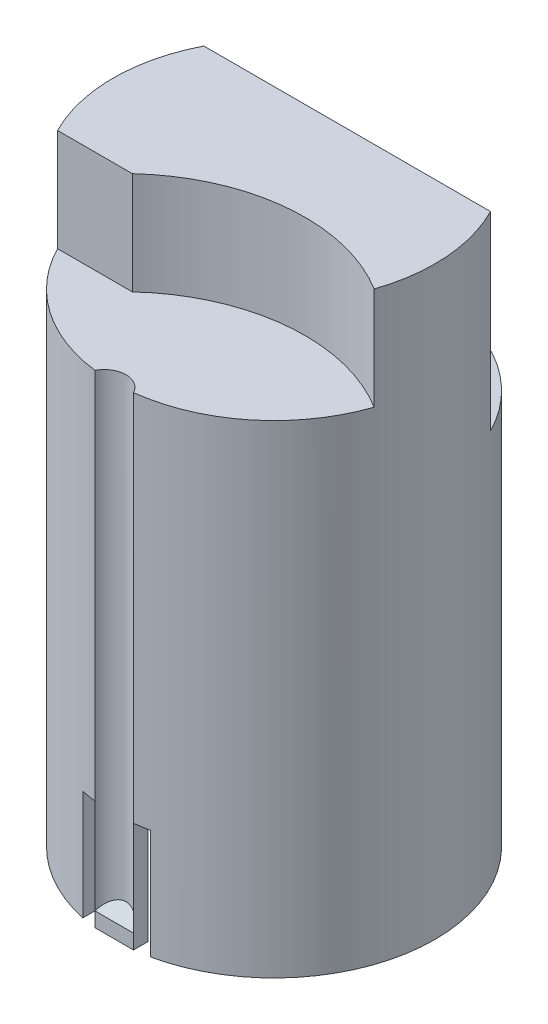
ISO-10303-21;
HEADER;
FILE_DESCRIPTION(('STEP AP214'),'2;1');
FILE_NAME('part.step','',(''),(''),'','','');
FILE_SCHEMA(('AUTOMOTIVE_DESIGN { 1 0 10303 214 1 1 1 1 }'));
ENDSEC;
DATA;
#1=APPLICATION_CONTEXT('core data for automotive mechanical design processes');
#2=APPLICATION_PROTOCOL_DEFINITION('international standard','automotive_design',2000,#1);
#3=PRODUCT_CONTEXT('',#1,'mechanical');
#4=PRODUCT('Part','Part','',(#3));
#5=PRODUCT_RELATED_PRODUCT_CATEGORY('part','',(#4));
#6=PRODUCT_DEFINITION_FORMATION('','',#4);
#7=PRODUCT_DEFINITION_CONTEXT('part definition',#1,'design');
#8=PRODUCT_DEFINITION('design','',#6,#7);
#9=PRODUCT_DEFINITION_SHAPE('','',#8);
#10=(LENGTH_UNIT() NAMED_UNIT(*) SI_UNIT(.MILLI.,.METRE.));
#11=(NAMED_UNIT(*) PLANE_ANGLE_UNIT() SI_UNIT($,.RADIAN.));
#12=(NAMED_UNIT(*) SI_UNIT($,.STERADIAN.) SOLID_ANGLE_UNIT());
#13=UNCERTAINTY_MEASURE_WITH_UNIT(LENGTH_MEASURE(1.E-05),#10,'distance_accuracy_value','');
#14=(GEOMETRIC_REPRESENTATION_CONTEXT(3) GLOBAL_UNCERTAINTY_ASSIGNED_CONTEXT((#13)) GLOBAL_UNIT_ASSIGNED_CONTEXT((#10,
#11,#12)) REPRESENTATION_CONTEXT('',''));
#15=CARTESIAN_POINT('',(0.,0.,0.));
#16=DIRECTION('',(0.,0.,1.));
#17=DIRECTION('',(1.,0.,0.));
#18=AXIS2_PLACEMENT_3D('',#15,#16,#17);
#19=CARTESIAN_POINT('',(0.,0.,0.));
#20=DIRECTION('',(0.,1.,0.));
#21=DIRECTION('',(0.,0.,1.));
#22=AXIS2_PLACEMENT_3D('',#19,#20,#21);
#23=PLANE('',#22);
#24=DIRECTION('',(0.,0.,1.));
#25=VECTOR('',#24,1.);
#26=CARTESIAN_POINT('',(1.31546342865539,0.,5.));
#27=LINE('',#26,#25);
#28=CARTESIAN_POINT('',(1.31546342865539,0.,9.9131002198036));
#29=VERTEX_POINT('',#28);
#30=CARTESIAN_POINT('',(1.31546342865539,0.,10.9210602034725));
#31=VERTEX_POINT('',#30);
#32=EDGE_CURVE('E217',#29,#31,#27,.T.);
#33=ORIENTED_EDGE('',*,*,#32,.T.);
#34=DIRECTION('',(-1.,0.,0.));
#35=VECTOR('',#34,1.);
#36=CARTESIAN_POINT('',(-1.31546342865521,0.,10.9210602034725));
#37=LINE('',#36,#35);
#38=CARTESIAN_POINT('',(-1.31546342865521,0.,10.9210602034725));
#39=VERTEX_POINT('',#38);
#40=EDGE_CURVE('E193',#31,#39,#37,.T.);
#41=ORIENTED_EDGE('',*,*,#40,.T.);
#42=DIRECTION('',(0.,0.,1.));
#43=VECTOR('',#42,1.);
#44=CARTESIAN_POINT('',(-1.31546342865521,0.,5.));
#45=LINE('',#44,#43);
#46=CARTESIAN_POINT('',(-1.31546342865521,0.,9.91310021980362));
#47=VERTEX_POINT('',#46);
#48=EDGE_CURVE('E203',#47,#39,#45,.T.);
#49=ORIENTED_EDGE('',*,*,#48,.F.);
#50=DIRECTION('',(1.,0.,0.));
#51=VECTOR('',#50,1.);
#52=CARTESIAN_POINT('',(1.31546342865539,0.,9.9131002198036));
#53=LINE('',#52,#51);
#54=EDGE_CURVE('E189',#47,#29,#53,.T.);
#55=ORIENTED_EDGE('',*,*,#54,.T.);
#56=EDGE_LOOP('',(#33,#41,#49,#55));
#57=FACE_BOUND('',#56,.T.);
#58=ADVANCED_FACE('F41',(#57),#23,.F.);
#59=CARTESIAN_POINT('',(0.,40.,0.));
#60=DIRECTION('',(0.,-1.,0.));
#61=DIRECTION('',(0.,0.,-1.));
#62=AXIS2_PLACEMENT_3D('',#59,#60,#61);
#63=CYLINDRICAL_SURFACE('',#62,11.);
#64=CARTESIAN_POINT('',(0.,0.,0.));
#65=DIRECTION('',(0.,1.,0.));
#66=DIRECTION('',(0.,0.,1.));
#67=AXIS2_PLACEMENT_3D('',#64,#65,#66);
#68=CIRCLE('',#67,11.);
#69=CARTESIAN_POINT('',(2.31546342865539,0.,10.7535403058974));
#70=VERTEX_POINT('',#69);
#71=CARTESIAN_POINT('',(-2.31546342865521,0.,10.7535403058974));
#72=VERTEX_POINT('',#71);
#73=EDGE_CURVE('E313',#70,#72,#68,.T.);
#74=ORIENTED_EDGE('',*,*,#73,.T.);
#75=DIRECTION('',(0.,-1.,0.));
#76=VECTOR('',#75,1.);
#77=CARTESIAN_POINT('',(-2.31546342865521,40.,10.7535403058974));
#78=LINE('',#77,#76);
#79=CARTESIAN_POINT('',(-2.31546342865521,7.5,10.7535403058974));
#80=VERTEX_POINT('',#79);
#81=EDGE_CURVE('E241',#72,#80,#78,.F.);
#82=ORIENTED_EDGE('',*,*,#81,.T.);
#83=CARTESIAN_POINT('',(0.,7.5,0.));
#84=DIRECTION('',(0.,1.,0.));
#85=DIRECTION('',(0.,0.,1.));
#86=AXIS2_PLACEMENT_3D('',#83,#84,#85);
#87=CIRCLE('',#86,11.);
#88=CARTESIAN_POINT('',(-1.31546342865521,7.5,10.9210602034725));
#89=VERTEX_POINT('',#88);
#90=EDGE_CURVE('E237',#80,#89,#87,.T.);
#91=ORIENTED_EDGE('',*,*,#90,.T.);
#92=DIRECTION('',(0.,1.,0.));
#93=VECTOR('',#92,1.);
#94=CARTESIAN_POINT('',(-1.31546342865521,0.,10.9210602034725));
#95=LINE('',#94,#93);
#96=CARTESIAN_POINT('',(-1.31546342865521,33.,10.9210602034725));
#97=VERTEX_POINT('',#96);
#98=EDGE_CURVE('E263',#89,#97,#95,.T.);
#99=ORIENTED_EDGE('',*,*,#98,.T.);
#100=CARTESIAN_POINT('',(0.,33.,0.));
#101=DIRECTION('',(0.,1.,0.));
#102=DIRECTION('',(0.,0.,1.));
#103=AXIS2_PLACEMENT_3D('',#100,#101,#102);
#104=CIRCLE('',#103,11.);
#105=CARTESIAN_POINT('',(-9.79795897113271,33.,5.));
#106=VERTEX_POINT('',#105);
#107=EDGE_CURVE('E268',#106,#97,#104,.T.);
#108=ORIENTED_EDGE('',*,*,#107,.F.);
#109=DIRECTION('',(0.,1.,0.));
#110=VECTOR('',#109,1.);
#111=CARTESIAN_POINT('',(-9.79795897113271,33.,5.));
#112=LINE('',#111,#110);
#113=CARTESIAN_POINT('',(-9.79795897113271,40.,5.));
#114=VERTEX_POINT('',#113);
#115=EDGE_CURVE('E288',#106,#114,#112,.T.);
#116=ORIENTED_EDGE('',*,*,#115,.T.);
#117=CARTESIAN_POINT('',(0.,40.,0.));
#118=DIRECTION('',(0.,1.,0.));
#119=DIRECTION('',(0.,0.,1.));
#120=AXIS2_PLACEMENT_3D('',#117,#118,#119);
#121=CIRCLE('',#120,11.);
#122=CARTESIAN_POINT('',(-9.79795897113271,40.,-5.));
#123=VERTEX_POINT('',#122);
#124=EDGE_CURVE('E316',#123,#114,#121,.T.);
#125=ORIENTED_EDGE('',*,*,#124,.F.);
#126=DIRECTION('',(0.,1.,0.));
#127=VECTOR('',#126,1.);
#128=CARTESIAN_POINT('',(-9.79795897113271,27.,-5.));
#129=LINE('',#128,#127);
#130=CARTESIAN_POINT('',(-9.79795897113271,27.,-5.));
#131=VERTEX_POINT('',#130);
#132=EDGE_CURVE('E305',#131,#123,#129,.T.);
#133=ORIENTED_EDGE('',*,*,#132,.F.);
#134=CARTESIAN_POINT('',(0.,27.,0.));
#135=DIRECTION('',(0.,1.,0.));
#136=DIRECTION('',(0.,0.,1.));
#137=AXIS2_PLACEMENT_3D('',#134,#135,#136);
#138=CIRCLE('',#137,11.);
#139=CARTESIAN_POINT('',(9.79795897113271,27.,-5.));
#140=VERTEX_POINT('',#139);
#141=EDGE_CURVE('E298',#140,#131,#138,.T.);
#142=ORIENTED_EDGE('',*,*,#141,.F.);
#143=DIRECTION('',(0.,1.,0.));
#144=VECTOR('',#143,1.);
#145=CARTESIAN_POINT('',(9.79795897113271,27.,-5.));
#146=LINE('',#145,#144);
#147=CARTESIAN_POINT('',(9.79795897113271,40.,-5.));
#148=VERTEX_POINT('',#147);
#149=EDGE_CURVE('E309',#140,#148,#146,.T.);
#150=ORIENTED_EDGE('',*,*,#149,.T.);
#151=CARTESIAN_POINT('',(10.4064663065849,40.,3.56447177151303));
#152=VERTEX_POINT('',#151);
#153=EDGE_CURVE('E321',#152,#148,#121,.T.);
#154=ORIENTED_EDGE('',*,*,#153,.F.);
#155=DIRECTION('',(0.,1.,0.));
#156=VECTOR('',#155,1.);
#157=CARTESIAN_POINT('',(10.4064663065849,33.,3.56447177151303));
#158=LINE('',#157,#156);
#159=CARTESIAN_POINT('',(10.4064663065849,33.,3.56447177151303));
#160=VERTEX_POINT('',#159);
#161=EDGE_CURVE('E281',#160,#152,#158,.T.);
#162=ORIENTED_EDGE('',*,*,#161,.F.);
#163=CARTESIAN_POINT('',(1.31546342865538,33.,10.9210602034725));
#164=VERTEX_POINT('',#163);
#165=EDGE_CURVE('E273',#164,#160,#104,.T.);
#166=ORIENTED_EDGE('',*,*,#165,.F.);
#167=DIRECTION('',(0.,1.,0.));
#168=VECTOR('',#167,1.);
#169=CARTESIAN_POINT('',(1.31546342865539,0.,10.9210602034725));
#170=LINE('',#169,#168);
#171=CARTESIAN_POINT('',(1.31546342865539,7.5,10.9210602034725));
#172=VERTEX_POINT('',#171);
#173=EDGE_CURVE('E257',#172,#164,#170,.T.);
#174=ORIENTED_EDGE('',*,*,#173,.F.);
#175=CARTESIAN_POINT('',(0.,7.5,0.));
#176=DIRECTION('',(0.,1.,0.));
#177=DIRECTION('',(0.,0.,1.));
#178=AXIS2_PLACEMENT_3D('',#175,#176,#177);
#179=CIRCLE('',#178,11.);
#180=CARTESIAN_POINT('',(2.31546342865539,7.5,10.7535403058974));
#181=VERTEX_POINT('',#180);
#182=EDGE_CURVE('E233',#172,#181,#179,.T.);
#183=ORIENTED_EDGE('',*,*,#182,.T.);
#184=DIRECTION('',(0.,-1.,0.));
#185=VECTOR('',#184,1.);
#186=CARTESIAN_POINT('',(2.31546342865538,40.,10.7535403058974));
#187=LINE('',#186,#185);
#188=EDGE_CURVE('E206',#181,#70,#187,.T.);
#189=ORIENTED_EDGE('',*,*,#188,.T.);
#190=EDGE_LOOP('',(#74,#82,#91,#99,#108,#116,#125,#133,#142,#150,#154,#162,#166,#174,#183,#189));
#191=FACE_BOUND('',#190,.T.);
#192=ADVANCED_FACE('F360',(#191),#63,.T.);
#193=CARTESIAN_POINT('',(0.,40.,0.));
#194=DIRECTION('',(0.,1.,0.));
#195=DIRECTION('',(0.,0.,1.));
#196=AXIS2_PLACEMENT_3D('',#193,#194,#195);
#197=PLANE('',#196);
#198=DIRECTION('',(-1.,0.,0.));
#199=VECTOR('',#198,1.);
#200=CARTESIAN_POINT('',(-9.79795897113271,40.,5.));
#201=LINE('',#200,#199);
#202=CARTESIAN_POINT('',(-4.68301584102613,40.,5.));
#203=VERTEX_POINT('',#202);
#204=EDGE_CURVE('E285',#203,#114,#201,.T.);
#205=ORIENTED_EDGE('',*,*,#204,.F.);
#206=CARTESIAN_POINT('',(3.80314891468438,40.,14.1779631585084));
#207=DIRECTION('',(0.,1.,0.));
#208=DIRECTION('',(0.,0.,1.));
#209=AXIS2_PLACEMENT_3D('',#206,#207,#208);
#210=CIRCLE('',#209,12.5);
#211=EDGE_CURVE('E262',#152,#203,#210,.T.);
#212=ORIENTED_EDGE('',*,*,#211,.F.);
#213=ORIENTED_EDGE('',*,*,#153,.T.);
#214=DIRECTION('',(1.,0.,0.));
#215=VECTOR('',#214,1.);
#216=CARTESIAN_POINT('',(-9.79795897113271,40.,-5.));
#217=LINE('',#216,#215);
#218=EDGE_CURVE('E292',#123,#148,#217,.T.);
#219=ORIENTED_EDGE('',*,*,#218,.F.);
#220=ORIENTED_EDGE('',*,*,#124,.T.);
#221=EDGE_LOOP('',(#205,#212,#213,#219,#220));
#222=FACE_BOUND('',#221,.T.);
#223=ADVANCED_FACE('F377',(#222),#197,.T.);
#224=CARTESIAN_POINT('',(0.,0.,0.));
#225=DIRECTION('',(0.,-1.,0.));
#226=DIRECTION('',(0.,0.,-1.));
#227=AXIS2_PLACEMENT_3D('',#224,#225,#226);
#228=CIRCLE('',#227,10.);
#229=CARTESIAN_POINT('',(-2.31546342865521,0.,9.72823874658513));
#230=VERTEX_POINT('',#229);
#231=CARTESIAN_POINT('',(2.31546342865539,0.,9.72823874658509));
#232=VERTEX_POINT('',#231);
#233=EDGE_CURVE('E245',#230,#232,#228,.T.);
#234=ORIENTED_EDGE('',*,*,#233,.F.);
#235=DIRECTION('',(0.,0.,1.));
#236=VECTOR('',#235,1.);
#237=CARTESIAN_POINT('',(-2.31546342865521,0.,5.));
#238=LINE('',#237,#236);
#239=EDGE_CURVE('E207',#230,#72,#238,.T.);
#240=ORIENTED_EDGE('',*,*,#239,.T.);
#241=ORIENTED_EDGE('',*,*,#73,.F.);
#242=DIRECTION('',(0.,0.,1.));
#243=VECTOR('',#242,1.);
#244=CARTESIAN_POINT('',(2.31546342865539,0.,5.));
#245=LINE('',#244,#243);
#246=EDGE_CURVE('E180',#232,#70,#245,.T.);
#247=ORIENTED_EDGE('',*,*,#246,.F.);
#248=EDGE_LOOP('',(#234,#240,#241,#247));
#249=FACE_BOUND('',#248,.T.);
#250=ADVANCED_FACE('F358',(#249),#23,.F.);
#251=CARTESIAN_POINT('',(-9.79795897113271,27.,-5.));
#252=DIRECTION('',(0.,0.,1.));
#253=DIRECTION('',(1.,0.,0.));
#254=AXIS2_PLACEMENT_3D('',#251,#252,#253);
#255=PLANE('',#254);
#256=ORIENTED_EDGE('',*,*,#218,.T.);
#257=ORIENTED_EDGE('',*,*,#149,.F.);
#258=DIRECTION('',(1.,0.,0.));
#259=VECTOR('',#258,1.);
#260=CARTESIAN_POINT('',(-9.79795897113271,27.,-5.));
#261=LINE('',#260,#259);
#262=EDGE_CURVE('E301',#131,#140,#261,.T.);
#263=ORIENTED_EDGE('',*,*,#262,.F.);
#264=ORIENTED_EDGE('',*,*,#132,.T.);
#265=EDGE_LOOP('',(#256,#257,#263,#264));
#266=FACE_BOUND('',#265,.T.);
#267=ADVANCED_FACE('F380',(#266),#255,.F.);
#268=CARTESIAN_POINT('',(0.,27.,0.));
#269=DIRECTION('',(0.,1.,0.));
#270=DIRECTION('',(0.,0.,1.));
#271=AXIS2_PLACEMENT_3D('',#268,#269,#270);
#272=PLANE('',#271);
#273=ORIENTED_EDGE('',*,*,#141,.T.);
#274=ORIENTED_EDGE('',*,*,#262,.T.);
#275=EDGE_LOOP('',(#273,#274));
#276=FACE_BOUND('',#275,.T.);
#277=ADVANCED_FACE('F385',(#276),#272,.T.);
#278=CARTESIAN_POINT('',(-9.79795897113271,33.,5.));
#279=DIRECTION('',(0.,0.,-1.));
#280=DIRECTION('',(-1.,0.,0.));
#281=AXIS2_PLACEMENT_3D('',#278,#279,#280);
#282=PLANE('',#281);
#283=ORIENTED_EDGE('',*,*,#204,.T.);
#284=ORIENTED_EDGE('',*,*,#115,.F.);
#285=DIRECTION('',(-1.,0.,0.));
#286=VECTOR('',#285,1.);
#287=CARTESIAN_POINT('',(-9.79795897113271,33.,5.));
#288=LINE('',#287,#286);
#289=CARTESIAN_POINT('',(-4.68301584102613,33.,5.));
#290=VERTEX_POINT('',#289);
#291=EDGE_CURVE('E277',#290,#106,#288,.T.);
#292=ORIENTED_EDGE('',*,*,#291,.F.);
#293=DIRECTION('',(0.,1.,0.));
#294=VECTOR('',#293,1.);
#295=CARTESIAN_POINT('',(-4.68301584102613,33.,5.));
#296=LINE('',#295,#294);
#297=EDGE_CURVE('E293',#290,#203,#296,.T.);
#298=ORIENTED_EDGE('',*,*,#297,.T.);
#299=EDGE_LOOP('',(#283,#284,#292,#298));
#300=FACE_BOUND('',#299,.T.);
#301=ADVANCED_FACE('F395',(#300),#282,.F.);
#302=CARTESIAN_POINT('',(3.80314891468438,33.,14.1779631585084));
#303=DIRECTION('',(0.,1.,0.));
#304=DIRECTION('',(0.,0.,1.));
#305=AXIS2_PLACEMENT_3D('',#302,#303,#304);
#306=CYLINDRICAL_SURFACE('',#305,12.5);
#307=ORIENTED_EDGE('',*,*,#211,.T.);
#308=ORIENTED_EDGE('',*,*,#297,.F.);
#309=CARTESIAN_POINT('',(3.80314891468438,33.,14.1779631585084));
#310=DIRECTION('',(0.,1.,0.));
#311=DIRECTION('',(0.,0.,1.));
#312=AXIS2_PLACEMENT_3D('',#309,#310,#311);
#313=CIRCLE('',#312,12.5);
#314=EDGE_CURVE('E272',#160,#290,#313,.T.);
#315=ORIENTED_EDGE('',*,*,#314,.F.);
#316=ORIENTED_EDGE('',*,*,#161,.T.);
#317=EDGE_LOOP('',(#307,#308,#315,#316));
#318=FACE_BOUND('',#317,.T.);
#319=ADVANCED_FACE('F397',(#318),#306,.F.);
#320=CARTESIAN_POINT('',(0.,33.,0.));
#321=DIRECTION('',(0.,1.,0.));
#322=DIRECTION('',(0.,0.,1.));
#323=AXIS2_PLACEMENT_3D('',#320,#321,#322);
#324=PLANE('',#323);
#325=CARTESIAN_POINT('',(0.,33.,11.6022093244556));
#326=DIRECTION('',(0.,1.,0.));
#327=DIRECTION('',(0.,0.,1.));
#328=AXIS2_PLACEMENT_3D('',#325,#326,#327);
#329=CIRCLE('',#328,1.48135348824839);
#330=EDGE_CURVE('E253',#164,#97,#329,.T.);
#331=ORIENTED_EDGE('',*,*,#330,.F.);
#332=ORIENTED_EDGE('',*,*,#165,.T.);
#333=ORIENTED_EDGE('',*,*,#314,.T.);
#334=ORIENTED_EDGE('',*,*,#291,.T.);
#335=ORIENTED_EDGE('',*,*,#107,.T.);
#336=EDGE_LOOP('',(#331,#332,#333,#334,#335));
#337=FACE_BOUND('',#336,.T.);
#338=ADVANCED_FACE('F400',(#337),#324,.T.);
#339=CARTESIAN_POINT('',(0.,0.,11.6022093244556));
#340=DIRECTION('',(0.,1.,0.));
#341=DIRECTION('',(0.,0.,1.));
#342=AXIS2_PLACEMENT_3D('',#339,#340,#341);
#343=CYLINDRICAL_SURFACE('',#342,1.48135348824839);
#344=CARTESIAN_POINT('',(-1.31546342865521,0.999999999999982,10.9210602034725));
#345=VERTEX_POINT('',#344);
#346=EDGE_CURVE('E56',#345,#89,#95,.T.);
#347=ORIENTED_EDGE('',*,*,#346,.F.);
#348=CARTESIAN_POINT('',(0.,0.318850879016837,11.6022093244556));
#349=DIRECTION('',(0.,-0.707106781186544,-0.707106781186551));
#350=DIRECTION('',(0.,0.707106781186551,-0.707106781186544));
#351=AXIS2_PLACEMENT_3D('',#348,#349,#350);
#352=ELLIPSE('',#351,2.09495019374957,1.48135348824839);
#353=CARTESIAN_POINT('',(1.31546342865539,0.999999999999982,10.9210602034725));
#354=VERTEX_POINT('',#353);
#355=EDGE_CURVE('E12',#345,#354,#352,.T.);
#356=ORIENTED_EDGE('',*,*,#355,.T.);
#357=EDGE_CURVE('E64',#354,#172,#170,.T.);
#358=ORIENTED_EDGE('',*,*,#357,.T.);
#359=ORIENTED_EDGE('',*,*,#173,.T.);
#360=ORIENTED_EDGE('',*,*,#330,.T.);
#361=ORIENTED_EDGE('',*,*,#98,.F.);
#362=EDGE_LOOP('',(#347,#356,#358,#359,#360,#361));
#363=FACE_BOUND('',#362,.T.);
#364=ADVANCED_FACE('F366',(#363),#343,.F.);
#365=CARTESIAN_POINT('',(0.,25.,0.));
#366=DIRECTION('',(0.,1.,0.));
#367=DIRECTION('',(0.,0.,1.));
#368=AXIS2_PLACEMENT_3D('',#365,#366,#367);
#369=PLANE('',#368);
#370=CARTESIAN_POINT('',(0.,25.,0.));
#371=DIRECTION('',(0.,1.,0.));
#372=DIRECTION('',(0.,0.,1.));
#373=AXIS2_PLACEMENT_3D('',#370,#371,#372);
#374=CIRCLE('',#373,10.);
#375=CARTESIAN_POINT('',(0.,25.,10.));
#376=VERTEX_POINT('',#375);
#377=EDGE_CURVE('E249',#376,#376,#374,.F.);
#378=ORIENTED_EDGE('',*,*,#377,.T.);
#379=EDGE_LOOP('',(#378));
#380=FACE_BOUND('',#379,.T.);
#381=ADVANCED_FACE('F410',(#380),#369,.F.);
#382=CARTESIAN_POINT('',(0.,55.2842712474619,0.));
#383=DIRECTION('',(0.,-1.,0.));
#384=DIRECTION('',(0.,0.,-1.));
#385=AXIS2_PLACEMENT_3D('',#382,#383,#384);
#386=CYLINDRICAL_SURFACE('',#385,10.);
#387=DIRECTION('',(0.,-1.,0.));
#388=VECTOR('',#387,1.);
#389=CARTESIAN_POINT('',(1.31546342865538,55.2842712474619,9.9131002198036));
#390=LINE('',#389,#388);
#391=CARTESIAN_POINT('',(1.31546342865539,7.5,9.9131002198036));
#392=VERTEX_POINT('',#391);
#393=CARTESIAN_POINT('',(1.31546342865538,2.,9.9131002198036));
#394=VERTEX_POINT('',#393);
#395=EDGE_CURVE('E175',#392,#394,#390,.T.);
#396=ORIENTED_EDGE('',*,*,#395,.T.);
#397=CARTESIAN_POINT('',(0.,2.,0.));
#398=DIRECTION('',(0.,1.,0.));
#399=DIRECTION('',(0.,0.,1.));
#400=AXIS2_PLACEMENT_3D('',#397,#398,#399);
#401=CIRCLE('',#400,10.);
#402=CARTESIAN_POINT('',(-1.31546342865521,2.,9.91310021980362));
#403=VERTEX_POINT('',#402);
#404=EDGE_CURVE('E171',#394,#403,#401,.F.);
#405=ORIENTED_EDGE('',*,*,#404,.T.);
#406=DIRECTION('',(0.,-1.,0.));
#407=VECTOR('',#406,1.);
#408=CARTESIAN_POINT('',(-1.31546342865521,55.2842712474619,9.91310021980362));
#409=LINE('',#408,#407);
#410=CARTESIAN_POINT('',(-1.31546342865521,7.5,9.91310021980362));
#411=VERTEX_POINT('',#410);
#412=EDGE_CURVE('E154',#403,#411,#409,.F.);
#413=ORIENTED_EDGE('',*,*,#412,.T.);
#414=CARTESIAN_POINT('',(0.,7.5,0.));
#415=DIRECTION('',(0.,1.,0.));
#416=DIRECTION('',(0.,0.,1.));
#417=AXIS2_PLACEMENT_3D('',#414,#415,#416);
#418=CIRCLE('',#417,10.);
#419=CARTESIAN_POINT('',(-2.31546342865521,7.5,9.72823874658513));
#420=VERTEX_POINT('',#419);
#421=EDGE_CURVE('E333',#411,#420,#418,.F.);
#422=ORIENTED_EDGE('',*,*,#421,.T.);
#423=DIRECTION('',(0.,-1.,0.));
#424=VECTOR('',#423,1.);
#425=CARTESIAN_POINT('',(-2.31546342865521,55.2842712474619,9.72823874658513));
#426=LINE('',#425,#424);
#427=EDGE_CURVE('E167',#420,#230,#426,.T.);
#428=ORIENTED_EDGE('',*,*,#427,.T.);
#429=ORIENTED_EDGE('',*,*,#233,.T.);
#430=DIRECTION('',(0.,-1.,0.));
#431=VECTOR('',#430,1.);
#432=CARTESIAN_POINT('',(2.31546342865538,55.2842712474619,9.72823874658509));
#433=LINE('',#432,#431);
#434=CARTESIAN_POINT('',(2.31546342865538,7.5,9.72823874658509));
#435=VERTEX_POINT('',#434);
#436=EDGE_CURVE('E320',#232,#435,#433,.F.);
#437=ORIENTED_EDGE('',*,*,#436,.T.);
#438=CARTESIAN_POINT('',(0.,7.5,0.));
#439=DIRECTION('',(0.,1.,0.));
#440=DIRECTION('',(0.,0.,1.));
#441=AXIS2_PLACEMENT_3D('',#438,#439,#440);
#442=CIRCLE('',#441,10.);
#443=EDGE_CURVE('E328',#435,#392,#442,.F.);
#444=ORIENTED_EDGE('',*,*,#443,.T.);
#445=EDGE_LOOP('',(#396,#405,#413,#422,#428,#429,#437,#444));
#446=FACE_BOUND('',#445,.T.);
#447=ORIENTED_EDGE('',*,*,#377,.F.);
#448=EDGE_LOOP('',(#447));
#449=FACE_BOUND('',#448,.T.);
#450=ADVANCED_FACE('F172',(#446,#449),#386,.F.);
#451=CARTESIAN_POINT('',(1.31546342865539,0.,5.));
#452=DIRECTION('',(-1.,0.,0.));
#453=DIRECTION('',(0.,-1.,0.));
#454=AXIS2_PLACEMENT_3D('',#451,#452,#453);
#455=PLANE('',#454);
#456=ORIENTED_EDGE('',*,*,#357,.F.);
#457=EDGE_CURVE('E264',#31,#354,#170,.T.);
#458=ORIENTED_EDGE('',*,*,#457,.F.);
#459=ORIENTED_EDGE('',*,*,#32,.F.);
#460=DIRECTION('',(0.,-1.,0.));
#461=VECTOR('',#460,1.);
#462=CARTESIAN_POINT('',(1.31546342865539,2.,9.9131002198036));
#463=LINE('',#462,#461);
#464=EDGE_CURVE('E181',#394,#29,#463,.T.);
#465=ORIENTED_EDGE('',*,*,#464,.F.);
#466=ORIENTED_EDGE('',*,*,#395,.F.);
#467=DIRECTION('',(0.,0.,1.));
#468=VECTOR('',#467,1.);
#469=CARTESIAN_POINT('',(1.31546342865539,7.5,5.));
#470=LINE('',#469,#468);
#471=EDGE_CURVE('E221',#392,#172,#470,.T.);
#472=ORIENTED_EDGE('',*,*,#471,.T.);
#473=EDGE_LOOP('',(#456,#458,#459,#465,#466,#472));
#474=FACE_BOUND('',#473,.T.);
#475=ADVANCED_FACE('F345',(#474),#455,.F.);
#476=CARTESIAN_POINT('',(1.31546342865539,7.5,5.));
#477=DIRECTION('',(0.,1.,0.));
#478=DIRECTION('',(0.,0.,1.));
#479=AXIS2_PLACEMENT_3D('',#476,#477,#478);
#480=PLANE('',#479);
#481=ORIENTED_EDGE('',*,*,#471,.F.);
#482=ORIENTED_EDGE('',*,*,#443,.F.);
#483=DIRECTION('',(0.,0.,1.));
#484=VECTOR('',#483,1.);
#485=CARTESIAN_POINT('',(2.31546342865539,7.5,5.));
#486=LINE('',#485,#484);
#487=EDGE_CURVE('E224',#435,#181,#486,.T.);
#488=ORIENTED_EDGE('',*,*,#487,.T.);
#489=ORIENTED_EDGE('',*,*,#182,.F.);
#490=EDGE_LOOP('',(#481,#482,#488,#489));
#491=FACE_BOUND('',#490,.T.);
#492=ADVANCED_FACE('F351',(#491),#480,.F.);
#493=CARTESIAN_POINT('',(2.31546342865539,7.5,5.));
#494=DIRECTION('',(1.,0.,0.));
#495=DIRECTION('',(0.,1.,0.));
#496=AXIS2_PLACEMENT_3D('',#493,#494,#495);
#497=PLANE('',#496);
#498=ORIENTED_EDGE('',*,*,#487,.F.);
#499=ORIENTED_EDGE('',*,*,#436,.F.);
#500=ORIENTED_EDGE('',*,*,#246,.T.);
#501=ORIENTED_EDGE('',*,*,#188,.F.);
#502=EDGE_LOOP('',(#498,#499,#500,#501));
#503=FACE_BOUND('',#502,.T.);
#504=ADVANCED_FACE('F355',(#503),#497,.F.);
#505=CARTESIAN_POINT('',(-1.31546342865521,7.5,5.));
#506=DIRECTION('',(1.,0.,0.));
#507=DIRECTION('',(0.,0.,-1.));
#508=AXIS2_PLACEMENT_3D('',#505,#506,#507);
#509=PLANE('',#508);
#510=ORIENTED_EDGE('',*,*,#412,.F.);
#511=EDGE_CURVE('E159',#47,#403,#409,.F.);
#512=ORIENTED_EDGE('',*,*,#511,.F.);
#513=ORIENTED_EDGE('',*,*,#48,.T.);
#514=EDGE_CURVE('E258',#39,#345,#95,.T.);
#515=ORIENTED_EDGE('',*,*,#514,.T.);
#516=ORIENTED_EDGE('',*,*,#346,.T.);
#517=DIRECTION('',(0.,0.,1.));
#518=VECTOR('',#517,1.);
#519=CARTESIAN_POINT('',(-1.31546342865521,7.5,5.));
#520=LINE('',#519,#518);
#521=EDGE_CURVE('E162',#411,#89,#520,.T.);
#522=ORIENTED_EDGE('',*,*,#521,.F.);
#523=EDGE_LOOP('',(#510,#512,#513,#515,#516,#522));
#524=FACE_BOUND('',#523,.T.);
#525=ADVANCED_FACE('F156',(#524),#509,.F.);
#526=CARTESIAN_POINT('',(-2.31546342865521,0.,5.));
#527=DIRECTION('',(-1.,0.,0.));
#528=DIRECTION('',(0.,0.,1.));
#529=AXIS2_PLACEMENT_3D('',#526,#527,#528);
#530=PLANE('',#529);
#531=ORIENTED_EDGE('',*,*,#239,.F.);
#532=ORIENTED_EDGE('',*,*,#427,.F.);
#533=DIRECTION('',(0.,0.,1.));
#534=VECTOR('',#533,1.);
#535=CARTESIAN_POINT('',(-2.31546342865521,7.5,5.));
#536=LINE('',#535,#534);
#537=EDGE_CURVE('E211',#420,#80,#536,.T.);
#538=ORIENTED_EDGE('',*,*,#537,.T.);
#539=ORIENTED_EDGE('',*,*,#81,.F.);
#540=EDGE_LOOP('',(#531,#532,#538,#539));
#541=FACE_BOUND('',#540,.T.);
#542=ADVANCED_FACE('F424',(#541),#530,.F.);
#543=CARTESIAN_POINT('',(-2.31546342865521,7.5,5.));
#544=DIRECTION('',(0.,1.,0.));
#545=DIRECTION('',(0.,0.,1.));
#546=AXIS2_PLACEMENT_3D('',#543,#544,#545);
#547=PLANE('',#546);
#548=ORIENTED_EDGE('',*,*,#537,.F.);
#549=ORIENTED_EDGE('',*,*,#421,.F.);
#550=ORIENTED_EDGE('',*,*,#521,.T.);
#551=ORIENTED_EDGE('',*,*,#90,.F.);
#552=EDGE_LOOP('',(#548,#549,#550,#551));
#553=FACE_BOUND('',#552,.T.);
#554=ADVANCED_FACE('F425',(#553),#547,.F.);
#555=CARTESIAN_POINT('',(1.31546342865539,2.,9.9131002198036));
#556=DIRECTION('',(0.,0.,-1.));
#557=DIRECTION('',(-1.,0.,0.));
#558=AXIS2_PLACEMENT_3D('',#555,#556,#557);
#559=PLANE('',#558);
#560=ORIENTED_EDGE('',*,*,#54,.F.);
#561=ORIENTED_EDGE('',*,*,#511,.T.);
#562=DIRECTION('',(1.,0.,0.));
#563=VECTOR('',#562,1.);
#564=CARTESIAN_POINT('',(1.31546342865539,2.,9.9131002198036));
#565=LINE('',#564,#563);
#566=EDGE_CURVE('E187',#403,#394,#565,.T.);
#567=ORIENTED_EDGE('',*,*,#566,.T.);
#568=ORIENTED_EDGE('',*,*,#464,.T.);
#569=EDGE_LOOP('',(#560,#561,#567,#568));
#570=FACE_BOUND('',#569,.T.);
#571=ADVANCED_FACE('F185',(#570),#559,.T.);
#572=CARTESIAN_POINT('',(0.,2.,0.));
#573=DIRECTION('',(0.,1.,0.));
#574=DIRECTION('',(0.,0.,1.));
#575=AXIS2_PLACEMENT_3D('',#572,#573,#574);
#576=PLANE('',#575);
#577=ORIENTED_EDGE('',*,*,#404,.F.);
#578=ORIENTED_EDGE('',*,*,#566,.F.);
#579=EDGE_LOOP('',(#577,#578));
#580=FACE_BOUND('',#579,.T.);
#581=ADVANCED_FACE('F191',(#580),#576,.T.);
#582=CARTESIAN_POINT('',(-1.31546342865521,2.,10.9210602034725));
#583=DIRECTION('',(0.,0.,1.));
#584=DIRECTION('',(1.,0.,0.));
#585=AXIS2_PLACEMENT_3D('',#582,#583,#584);
#586=PLANE('',#585);
#587=ORIENTED_EDGE('',*,*,#457,.T.);
#588=DIRECTION('',(-1.,0.,0.));
#589=VECTOR('',#588,1.);
#590=CARTESIAN_POINT('',(-1.31546342865521,0.999999999999982,10.9210602034725));
#591=LINE('',#590,#589);
#592=EDGE_CURVE('E50',#354,#345,#591,.T.);
#593=ORIENTED_EDGE('',*,*,#592,.T.);
#594=ORIENTED_EDGE('',*,*,#514,.F.);
#595=ORIENTED_EDGE('',*,*,#40,.F.);
#596=EDGE_LOOP('',(#587,#593,#594,#595));
#597=FACE_BOUND('',#596,.T.);
#598=ADVANCED_FACE('F342',(#597),#586,.T.);
#599=CARTESIAN_POINT('',(-1.31546342865521,0.999999999999982,10.9210602034725));
#600=DIRECTION('',(0.,-0.707106781186544,-0.707106781186551));
#601=DIRECTION('',(-1.,0.,0.));
#602=AXIS2_PLACEMENT_3D('',#599,#600,#601);
#603=PLANE('',#602);
#604=ORIENTED_EDGE('',*,*,#592,.F.);
#605=ORIENTED_EDGE('',*,*,#355,.F.);
#606=EDGE_LOOP('',(#604,#605));
#607=FACE_BOUND('',#606,.T.);
#608=ADVANCED_FACE('F43',(#607),#603,.F.);
#609=CLOSED_SHELL('',(#58,#192,#223,#250,#267,#277,#301,#319,#338,#364,#381,#450,#475,#492,#504,
#525,#542,#554,#571,#581,#598,#608));
#610=MANIFOLD_SOLID_BREP('B2',#609);
#611=ADVANCED_BREP_SHAPE_REPRESENTATION('',(#18,#610),#14);
#612=SHAPE_DEFINITION_REPRESENTATION(#9,#611);
ENDSEC;
END-ISO-10303-21;
